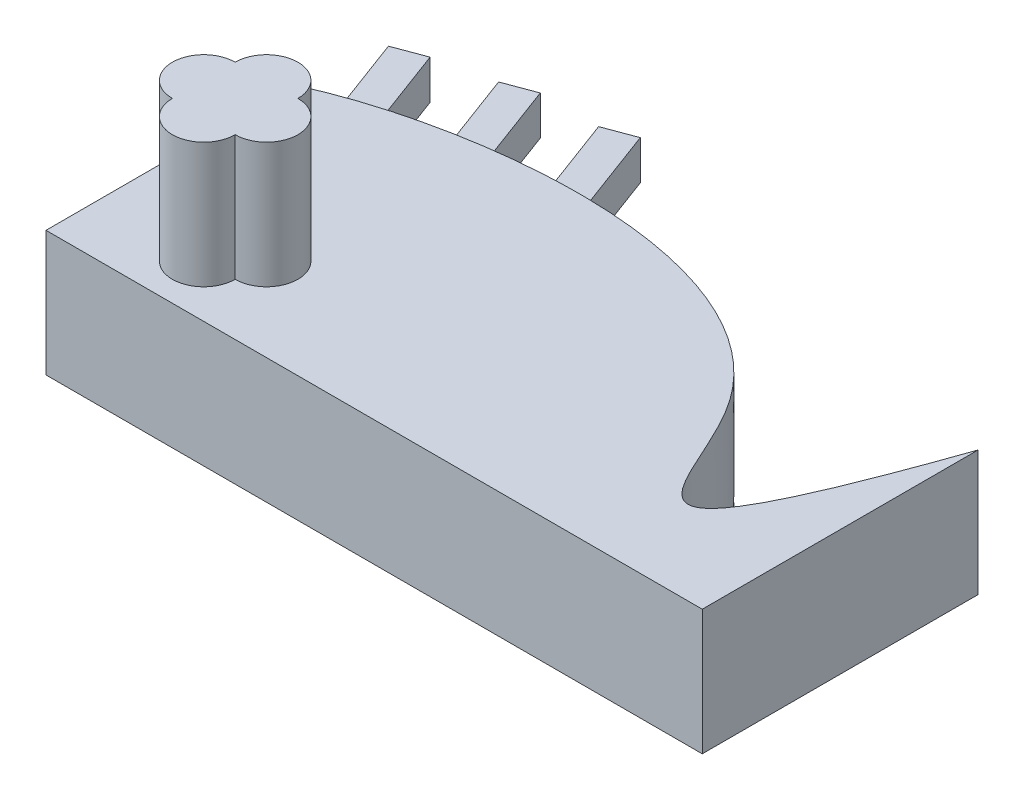
ISO-10303-21;
HEADER;
FILE_DESCRIPTION(('STEP AP214'),'2;1');
FILE_NAME('part.step','',(''),(''),'','','');
FILE_SCHEMA(('AUTOMOTIVE_DESIGN { 1 0 10303 214 1 1 1 1 }'));
ENDSEC;
DATA;
#1=APPLICATION_CONTEXT('core data for automotive mechanical design processes');
#2=APPLICATION_PROTOCOL_DEFINITION('international standard','automotive_design',2000,#1);
#3=PRODUCT_CONTEXT('',#1,'mechanical');
#4=PRODUCT('Part','Part','',(#3));
#5=PRODUCT_RELATED_PRODUCT_CATEGORY('part','',(#4));
#6=PRODUCT_DEFINITION_FORMATION('','',#4);
#7=PRODUCT_DEFINITION_CONTEXT('part definition',#1,'design');
#8=PRODUCT_DEFINITION('design','',#6,#7);
#9=PRODUCT_DEFINITION_SHAPE('','',#8);
#10=(LENGTH_UNIT() NAMED_UNIT(*) SI_UNIT(.MILLI.,.METRE.));
#11=(NAMED_UNIT(*) PLANE_ANGLE_UNIT() SI_UNIT($,.RADIAN.));
#12=(NAMED_UNIT(*) SI_UNIT($,.STERADIAN.) SOLID_ANGLE_UNIT());
#13=UNCERTAINTY_MEASURE_WITH_UNIT(LENGTH_MEASURE(1.E-05),#10,'distance_accuracy_value','');
#14=(GEOMETRIC_REPRESENTATION_CONTEXT(3) GLOBAL_UNCERTAINTY_ASSIGNED_CONTEXT((#13)) GLOBAL_UNIT_ASSIGNED_CONTEXT((#10,
#11,#12)) REPRESENTATION_CONTEXT('',''));
#15=CARTESIAN_POINT('',(0.,0.,0.));
#16=DIRECTION('',(0.,0.,1.));
#17=DIRECTION('',(1.,0.,0.));
#18=AXIS2_PLACEMENT_3D('',#15,#16,#17);
#19=CARTESIAN_POINT('',(-110.330728347982,14.4418262837156,-79.0933082133298));
#20=DIRECTION('',(-0.937117873035281,0.,0.349013025599091));
#21=DIRECTION('',(0.349013025599091,0.,0.937117873035281));
#22=AXIS2_PLACEMENT_3D('',#19,#20,#21);
#23=PLANE('',#22);
#24=DIRECTION('',(0.,-1.,0.));
#25=VECTOR('',#24,1.);
#26=CARTESIAN_POINT('',(-95.6721812728201,14.4418262837156,-39.734357545848));
#27=LINE('',#26,#25);
#28=CARTESIAN_POINT('',(-95.6721812728201,27.5581737162844,-39.734357545848));
#29=VERTEX_POINT('',#28);
#30=CARTESIAN_POINT('',(-95.6721812728201,14.4418262837156,-39.734357545848));
#31=VERTEX_POINT('',#30);
#32=EDGE_CURVE('E147',#29,#31,#27,.T.);
#33=ORIENTED_EDGE('',*,*,#32,.T.);
#34=DIRECTION('',(0.349013025599091,0.,0.937117873035281));
#35=VECTOR('',#34,1.);
#36=CARTESIAN_POINT('',(-110.330728347982,14.4418262837156,-79.0933082133298));
#37=LINE('',#36,#35);
#38=CARTESIAN_POINT('',(-110.330728347982,14.4418262837156,-79.0933082133298));
#39=VERTEX_POINT('',#38);
#40=EDGE_CURVE('E14',#39,#31,#37,.T.);
#41=ORIENTED_EDGE('',*,*,#40,.F.);
#42=DIRECTION('',(0.,-1.,0.));
#43=VECTOR('',#42,1.);
#44=CARTESIAN_POINT('',(-110.330728347982,14.4418262837156,-79.0933082133298));
#45=LINE('',#44,#43);
#46=CARTESIAN_POINT('',(-110.330728347982,27.5581737162844,-79.0933082133298));
#47=VERTEX_POINT('',#46);
#48=EDGE_CURVE('E135',#47,#39,#45,.T.);
#49=ORIENTED_EDGE('',*,*,#48,.F.);
#50=DIRECTION('',(0.349013025599091,0.,0.937117873035281));
#51=VECTOR('',#50,1.);
#52=CARTESIAN_POINT('',(-110.330728347982,27.5581737162844,-79.0933082133298));
#53=LINE('',#52,#51);
#54=EDGE_CURVE('E143',#47,#29,#53,.T.);
#55=ORIENTED_EDGE('',*,*,#54,.T.);
#56=EDGE_LOOP('',(#33,#41,#49,#55));
#57=FACE_BOUND('',#56,.T.);
#58=ADVANCED_FACE('F84',(#57),#23,.F.);
#59=CARTESIAN_POINT('',(-120.510683550477,14.4418262837156,-75.3019634231828));
#60=DIRECTION('',(0.,1.,0.));
#61=DIRECTION('',(0.,0.,1.));
#62=AXIS2_PLACEMENT_3D('',#59,#60,#61);
#63=PLANE('',#62);
#64=DIRECTION('',(-0.937117873035281,0.,0.349013025599091));
#65=VECTOR('',#64,1.);
#66=CARTESIAN_POINT('',(-105.852136475315,14.4418262837156,-35.943012755701));
#67=LINE('',#66,#65);
#68=CARTESIAN_POINT('',(-105.852136475315,14.4418262837156,-35.943012755701));
#69=VERTEX_POINT('',#68);
#70=EDGE_CURVE('E139',#31,#69,#67,.T.);
#71=ORIENTED_EDGE('',*,*,#70,.T.);
#72=DIRECTION('',(0.349013025599091,0.,0.937117873035281));
#73=VECTOR('',#72,1.);
#74=CARTESIAN_POINT('',(-120.510683550477,14.4418262837156,-75.3019634231828));
#75=LINE('',#74,#73);
#76=CARTESIAN_POINT('',(-120.510683550477,14.4418262837156,-75.3019634231828));
#77=VERTEX_POINT('',#76);
#78=EDGE_CURVE('E92',#77,#69,#75,.T.);
#79=ORIENTED_EDGE('',*,*,#78,.F.);
#80=DIRECTION('',(-0.937117873035281,0.,0.349013025599091));
#81=VECTOR('',#80,1.);
#82=CARTESIAN_POINT('',(-120.510683550477,14.4418262837156,-75.3019634231828));
#83=LINE('',#82,#81);
#84=EDGE_CURVE('E130',#39,#77,#83,.T.);
#85=ORIENTED_EDGE('',*,*,#84,.F.);
#86=ORIENTED_EDGE('',*,*,#40,.T.);
#87=EDGE_LOOP('',(#71,#79,#85,#86));
#88=FACE_BOUND('',#87,.T.);
#89=ADVANCED_FACE('F138',(#88),#63,.F.);
#90=CARTESIAN_POINT('',(-120.510683550477,14.4418262837156,-75.3019634231828));
#91=DIRECTION('',(0.937117873035281,0.,-0.349013025599091));
#92=DIRECTION('',(-0.349013025599091,0.,-0.937117873035281));
#93=AXIS2_PLACEMENT_3D('',#90,#91,#92);
#94=PLANE('',#93);
#95=DIRECTION('',(0.,1.,0.));
#96=VECTOR('',#95,1.);
#97=CARTESIAN_POINT('',(-105.852136475315,14.4418262837156,-35.943012755701));
#98=LINE('',#97,#96);
#99=CARTESIAN_POINT('',(-105.852136475315,27.5581737162844,-35.943012755701));
#100=VERTEX_POINT('',#99);
#101=EDGE_CURVE('E117',#69,#100,#98,.T.);
#102=ORIENTED_EDGE('',*,*,#101,.T.);
#103=DIRECTION('',(0.349013025599091,0.,0.937117873035281));
#104=VECTOR('',#103,1.);
#105=CARTESIAN_POINT('',(-120.510683550477,27.5581737162844,-75.3019634231828));
#106=LINE('',#105,#104);
#107=CARTESIAN_POINT('',(-120.510683550477,27.5581737162844,-75.3019634231828));
#108=VERTEX_POINT('',#107);
#109=EDGE_CURVE('E140',#108,#100,#106,.T.);
#110=ORIENTED_EDGE('',*,*,#109,.F.);
#111=DIRECTION('',(0.,1.,0.));
#112=VECTOR('',#111,1.);
#113=CARTESIAN_POINT('',(-120.510683550477,14.4418262837156,-75.3019634231828));
#114=LINE('',#113,#112);
#115=EDGE_CURVE('E133',#77,#108,#114,.T.);
#116=ORIENTED_EDGE('',*,*,#115,.F.);
#117=ORIENTED_EDGE('',*,*,#78,.T.);
#118=EDGE_LOOP('',(#102,#110,#116,#117));
#119=FACE_BOUND('',#118,.T.);
#120=ADVANCED_FACE('F141',(#119),#94,.F.);
#121=CARTESIAN_POINT('',(-120.510683550477,27.5581737162844,-75.3019634231828));
#122=DIRECTION('',(0.,-1.,0.));
#123=DIRECTION('',(0.,0.,-1.));
#124=AXIS2_PLACEMENT_3D('',#121,#122,#123);
#125=PLANE('',#124);
#126=DIRECTION('',(0.937117873035281,0.,-0.349013025599091));
#127=VECTOR('',#126,1.);
#128=CARTESIAN_POINT('',(-105.852136475315,27.5581737162844,-35.943012755701));
#129=LINE('',#128,#127);
#130=EDGE_CURVE('E123',#100,#29,#129,.T.);
#131=ORIENTED_EDGE('',*,*,#130,.T.);
#132=ORIENTED_EDGE('',*,*,#54,.F.);
#133=DIRECTION('',(0.937117873035281,0.,-0.349013025599091));
#134=VECTOR('',#133,1.);
#135=CARTESIAN_POINT('',(-120.510683550477,27.5581737162844,-75.3019634231828));
#136=LINE('',#135,#134);
#137=EDGE_CURVE('E100',#108,#47,#136,.T.);
#138=ORIENTED_EDGE('',*,*,#137,.F.);
#139=ORIENTED_EDGE('',*,*,#109,.T.);
#140=EDGE_LOOP('',(#131,#132,#138,#139));
#141=FACE_BOUND('',#140,.T.);
#142=ADVANCED_FACE('F154',(#141),#125,.F.);
#143=CARTESIAN_POINT('',(-39.3081553435585,0.,-105.544413035202));
#144=DIRECTION('',(-0.349013025599091,0.,-0.937117873035281));
#145=DIRECTION('',(-0.937117873035281,0.,0.349013025599091));
#146=AXIS2_PLACEMENT_3D('',#143,#144,#145);
#147=PLANE('',#146);
#148=ORIENTED_EDGE('',*,*,#48,.T.);
#149=ORIENTED_EDGE('',*,*,#84,.T.);
#150=ORIENTED_EDGE('',*,*,#115,.T.);
#151=ORIENTED_EDGE('',*,*,#137,.T.);
#152=EDGE_LOOP('',(#148,#149,#150,#151));
#153=FACE_BOUND('',#152,.T.);
#154=ADVANCED_FACE('F131',(#153),#147,.T.);
#155=CARTESIAN_POINT('',(-24.6496082683967,0.,-66.1854623677202));
#156=DIRECTION('',(-0.349013025599091,0.,-0.937117873035281));
#157=DIRECTION('',(-0.937117873035281,0.,0.349013025599091));
#158=AXIS2_PLACEMENT_3D('',#155,#156,#157);
#159=PLANE('',#158);
#160=ORIENTED_EDGE('',*,*,#32,.F.);
#161=ORIENTED_EDGE('',*,*,#130,.F.);
#162=ORIENTED_EDGE('',*,*,#101,.F.);
#163=ORIENTED_EDGE('',*,*,#70,.F.);
#164=EDGE_LOOP('',(#160,#161,#162,#163));
#165=FACE_BOUND('',#164,.T.);
#166=ADVANCED_FACE('F157',(#165),#159,.F.);
#167=CLOSED_SHELL('',(#58,#89,#120,#142,#154,#166));
#168=MANIFOLD_SOLID_BREP('B2',#167);
#169=CARTESIAN_POINT('',(-74.5826484380044,84.,11.4882685040511));
#170=DIRECTION('',(0.,-1.,0.));
#171=DIRECTION('',(0.,0.,-1.));
#172=AXIS2_PLACEMENT_3D('',#169,#170,#171);
#173=CYLINDRICAL_SURFACE('',#172,10.5224386168195);
#174=DIRECTION('',(0.,-1.,0.));
#175=VECTOR('',#174,1.);
#176=CARTESIAN_POINT('',(-85.1050870548239,63.0000000000001,11.4882685040512));
#177=LINE('',#176,#175);
#178=CARTESIAN_POINT('',(-85.1050870548239,84.,11.4882685040514));
#179=VERTEX_POINT('',#178);
#180=CARTESIAN_POINT('',(-85.1050870548239,42.,11.4882685040511));
#181=VERTEX_POINT('',#180);
#182=EDGE_CURVE('E383',#179,#181,#177,.T.);
#183=ORIENTED_EDGE('',*,*,#182,.F.);
#184=CARTESIAN_POINT('',(-74.5826484380044,84.,11.4882685040511));
#185=DIRECTION('',(0.,1.,0.));
#186=DIRECTION('',(0.,0.,1.));
#187=AXIS2_PLACEMENT_3D('',#184,#185,#186);
#188=CIRCLE('',#187,10.5224386168195);
#189=CARTESIAN_POINT('',(-64.0602098211848,84.0000000000001,11.4882685040514));
#190=VERTEX_POINT('',#189);
#191=EDGE_CURVE('E387',#190,#179,#188,.T.);
#192=ORIENTED_EDGE('',*,*,#191,.F.);
#193=DIRECTION('',(0.,-1.,0.));
#194=VECTOR('',#193,1.);
#195=CARTESIAN_POINT('',(-64.0602098211848,63.0000000000001,11.4882685040512));
#196=LINE('',#195,#194);
#197=CARTESIAN_POINT('',(-64.0602098211848,42.,11.4882685040512));
#198=VERTEX_POINT('',#197);
#199=EDGE_CURVE('E364',#198,#190,#196,.F.);
#200=ORIENTED_EDGE('',*,*,#199,.F.);
#201=CARTESIAN_POINT('',(-74.5826484380044,42.,11.4882685040511));
#202=DIRECTION('',(0.,-1.,0.));
#203=DIRECTION('',(0.,0.,-1.));
#204=AXIS2_PLACEMENT_3D('',#201,#202,#203);
#205=CIRCLE('',#204,10.5224386168195);
#206=EDGE_CURVE('E82',#198,#181,#205,.F.);
#207=ORIENTED_EDGE('',*,*,#206,.T.);
#208=EDGE_LOOP('',(#183,#192,#200,#207));
#209=FACE_BOUND('',#208,.T.);
#210=ADVANCED_FACE('F208',(#209),#173,.T.);
#211=CARTESIAN_POINT('',(-110.,401.10438679184,-34.018302372733));
#212=CARTESIAN_POINT('',(-67.2471150708879,401.10438679184,-53.6902094858161));
#213=CARTESIAN_POINT('',(72.7205199180523,401.10438679184,-69.0777009280798));
#214=CARTESIAN_POINT('',(73.8098024767226,401.10438679184,61.2581735272852));
#215=CARTESIAN_POINT('',(110.,401.10438679184,-42.435201928873));
#216=B_SPLINE_CURVE_WITH_KNOTS('',3,(#211,#212,#213,#214,#215),.UNSPECIFIED.,.F.,.F.,(4,1,4),
(0.,0.646100978433412,1.),.UNSPECIFIED.);
#217=DIRECTION('',(0.,-1.,0.));
#218=VECTOR('',#217,1.);
#219=SURFACE_OF_LINEAR_EXTRUSION('',#216,#218);
#220=CARTESIAN_POINT('',(-110.,42.,-34.018302372733));
#221=CARTESIAN_POINT('',(-67.2471150708879,42.,-53.6902094858161));
#222=CARTESIAN_POINT('',(72.7205199180523,42.,-69.0777009280798));
#223=CARTESIAN_POINT('',(73.8098024767226,42.,61.2581735272852));
#224=CARTESIAN_POINT('',(110.,42.,-42.435201928873));
#225=B_SPLINE_CURVE_WITH_KNOTS('',3,(#220,#221,#222,#223,#224),.UNSPECIFIED.,.F.,.F.,(4,1,4),
(0.,0.646100978433412,1.),.UNSPECIFIED.);
#226=CARTESIAN_POINT('',(-33.6675982245598,42.,-50.));
#227=VERTEX_POINT('',#226);
#228=CARTESIAN_POINT('',(-110.,42.,-34.0183023727329));
#229=VERTEX_POINT('',#228);
#230=EDGE_CURVE('E474',#227,#229,#225,.F.);
#231=ORIENTED_EDGE('',*,*,#230,.F.);
#232=DIRECTION('',(0.,-1.,0.));
#233=VECTOR('',#232,1.);
#234=CARTESIAN_POINT('',(-33.667598224559,21.,-50.));
#235=LINE('',#234,#233);
#236=CARTESIAN_POINT('',(-33.6675982245598,0.,-50.));
#237=VERTEX_POINT('',#236);
#238=EDGE_CURVE('E508',#227,#237,#235,.T.);
#239=ORIENTED_EDGE('',*,*,#238,.T.);
#240=CARTESIAN_POINT('',(-110.,0.,-34.018302372733));
#241=CARTESIAN_POINT('',(-67.2471150708879,0.,-53.6902094858161));
#242=CARTESIAN_POINT('',(72.7205199180523,0.,-69.0777009280798));
#243=CARTESIAN_POINT('',(73.8098024767226,0.,61.2581735272852));
#244=CARTESIAN_POINT('',(110.,0.,-42.435201928873));
#245=B_SPLINE_CURVE_WITH_KNOTS('',3,(#240,#241,#242,#243,#244),.UNSPECIFIED.,.F.,.F.,(4,1,4),
(0.,0.646100978433412,1.),.UNSPECIFIED.);
#246=CARTESIAN_POINT('',(-110.,0.,-34.018302372733));
#247=VERTEX_POINT('',#246);
#248=EDGE_CURVE('E491',#237,#247,#245,.F.);
#249=ORIENTED_EDGE('',*,*,#248,.T.);
#250=DIRECTION('',(0.,-1.,0.));
#251=VECTOR('',#250,1.);
#252=CARTESIAN_POINT('',(-110.,401.10438679184,-34.018302372733));
#253=LINE('',#252,#251);
#254=EDGE_CURVE('E498',#229,#247,#253,.T.);
#255=ORIENTED_EDGE('',*,*,#254,.F.);
#256=EDGE_LOOP('',(#231,#239,#249,#255));
#257=FACE_BOUND('',#256,.T.);
#258=DIRECTION('',(0.,-1.,0.));
#259=VECTOR('',#258,1.);
#260=CARTESIAN_POINT('',(-77.2681220435755,21.,-44.7578339003173));
#261=LINE('',#260,#259);
#262=CARTESIAN_POINT('',(-77.2681220435756,27.5581737162844,-44.7578339003176));
#263=VERTEX_POINT('',#262);
#264=CARTESIAN_POINT('',(-77.2681220435755,14.4418262837156,-44.7578339003173));
#265=VERTEX_POINT('',#264);
#266=EDGE_CURVE('E572',#263,#265,#261,.T.);
#267=ORIENTED_EDGE('',*,*,#266,.T.);
#268=CARTESIAN_POINT('',(-110.,14.4418262837156,-34.018302372733));
#269=CARTESIAN_POINT('',(-67.2471150708879,14.4418262837156,-53.6902094858161));
#270=CARTESIAN_POINT('',(72.7205199180523,14.4418262837156,-69.0777009280798));
#271=CARTESIAN_POINT('',(73.8098024767226,14.4418262837156,61.2581735272852));
#272=CARTESIAN_POINT('',(110.,14.4418262837156,-42.435201928873));
#273=B_SPLINE_CURVE_WITH_KNOTS('',3,(#268,#269,#270,#271,#272),.UNSPECIFIED.,.F.,.F.,(4,1,4),
(0.,0.646100978433412,1.),.UNSPECIFIED.);
#274=CARTESIAN_POINT('',(-71.8986472816458,14.4418262837156,-45.9030420848122));
#275=VERTEX_POINT('',#274);
#276=EDGE_CURVE('E583',#265,#275,#273,.T.);
#277=ORIENTED_EDGE('',*,*,#276,.T.);
#278=DIRECTION('',(0.,-1.,0.));
#279=VECTOR('',#278,1.);
#280=CARTESIAN_POINT('',(-71.8986472816458,21.,-45.9030420848122));
#281=LINE('',#280,#279);
#282=CARTESIAN_POINT('',(-71.8986472816458,27.5581737162844,-45.9030420848122));
#283=VERTEX_POINT('',#282);
#284=EDGE_CURVE('E560',#275,#283,#281,.F.);
#285=ORIENTED_EDGE('',*,*,#284,.T.);
#286=CARTESIAN_POINT('',(-110.,27.5581737162844,-34.018302372733));
#287=CARTESIAN_POINT('',(-67.2471150708879,27.5581737162844,-53.6902094858161));
#288=CARTESIAN_POINT('',(72.7205199180523,27.5581737162844,-69.0777009280798));
#289=CARTESIAN_POINT('',(73.8098024767226,27.5581737162844,61.2581735272852));
#290=CARTESIAN_POINT('',(110.,27.5581737162844,-42.435201928873));
#291=B_SPLINE_CURVE_WITH_KNOTS('',3,(#286,#287,#288,#289,#290),.UNSPECIFIED.,.F.,.F.,(4,1,4),
(0.,0.646100978433412,1.),.UNSPECIFIED.);
#292=EDGE_CURVE('E567',#283,#263,#291,.F.);
#293=ORIENTED_EDGE('',*,*,#292,.T.);
#294=EDGE_LOOP('',(#267,#277,#285,#293));
#295=FACE_BOUND('',#294,.T.);
#296=DIRECTION('',(0.,-1.,0.));
#297=VECTOR('',#296,1.);
#298=CARTESIAN_POINT('',(-47.8146007751934,21.,-49.3119283923371));
#299=LINE('',#298,#297);
#300=CARTESIAN_POINT('',(-47.8146007751934,27.5581737162844,-49.3119283923371));
#301=VERTEX_POINT('',#300);
#302=CARTESIAN_POINT('',(-47.8146007751934,14.4418262837156,-49.3119283923371));
#303=VERTEX_POINT('',#302);
#304=EDGE_CURVE('E601',#301,#303,#299,.T.);
#305=ORIENTED_EDGE('',*,*,#304,.T.);
#306=CARTESIAN_POINT('',(-110.,14.4418262837156,-34.018302372733));
#307=CARTESIAN_POINT('',(-67.2471150708879,14.4418262837156,-53.6902094858161));
#308=CARTESIAN_POINT('',(72.7205199180523,14.4418262837156,-69.0777009280798));
#309=CARTESIAN_POINT('',(73.8098024767226,14.4418262837156,61.2581735272852));
#310=CARTESIAN_POINT('',(110.,14.4418262837156,-42.435201928873));
#311=B_SPLINE_CURVE_WITH_KNOTS('',3,(#306,#307,#308,#309,#310),.UNSPECIFIED.,.F.,.F.,(4,1,4),
(0.,0.646100978433412,1.),.UNSPECIFIED.);
#312=CARTESIAN_POINT('',(-42.1656827907477,14.4418262837156,-49.7068171929958));
#313=VERTEX_POINT('',#312);
#314=EDGE_CURVE('E217',#303,#313,#311,.T.);
#315=ORIENTED_EDGE('',*,*,#314,.T.);
#316=DIRECTION('',(0.,-1.,0.));
#317=VECTOR('',#316,1.);
#318=CARTESIAN_POINT('',(-42.1656827907477,21.,-49.7068171929958));
#319=LINE('',#318,#317);
#320=CARTESIAN_POINT('',(-42.1656827907477,27.5581737162844,-49.7068171929958));
#321=VERTEX_POINT('',#320);
#322=EDGE_CURVE('E588',#313,#321,#319,.F.);
#323=ORIENTED_EDGE('',*,*,#322,.T.);
#324=CARTESIAN_POINT('',(-110.,27.5581737162844,-34.018302372733));
#325=CARTESIAN_POINT('',(-67.2471150708879,27.5581737162844,-53.6902094858161));
#326=CARTESIAN_POINT('',(72.7205199180523,27.5581737162844,-69.0777009280798));
#327=CARTESIAN_POINT('',(73.8098024767226,27.5581737162844,61.2581735272852));
#328=CARTESIAN_POINT('',(110.,27.5581737162844,-42.435201928873));
#329=B_SPLINE_CURVE_WITH_KNOTS('',3,(#324,#325,#326,#327,#328),.UNSPECIFIED.,.F.,.F.,(4,1,4),
(0.,0.646100978433412,1.),.UNSPECIFIED.);
#330=EDGE_CURVE('E595',#321,#301,#329,.F.);
#331=ORIENTED_EDGE('',*,*,#330,.T.);
#332=EDGE_LOOP('',(#305,#315,#323,#331));
#333=FACE_BOUND('',#332,.T.);
#334=ADVANCED_FACE('F615',(#257,#295,#333),#219,.T.);
#335=CARTESIAN_POINT('',(110.,42.,50.));
#336=DIRECTION('',(-1.,0.,0.));
#337=DIRECTION('',(0.,0.,1.));
#338=AXIS2_PLACEMENT_3D('',#335,#336,#337);
#339=PLANE('',#338);
#340=DIRECTION('',(0.,-1.,0.));
#341=VECTOR('',#340,1.);
#342=CARTESIAN_POINT('',(110.,401.10438679184,-42.435201928873));
#343=LINE('',#342,#341);
#344=CARTESIAN_POINT('',(110.,42.,-42.4352019288729));
#345=VERTEX_POINT('',#344);
#346=CARTESIAN_POINT('',(110.,0.,-42.4352019288729));
#347=VERTEX_POINT('',#346);
#348=EDGE_CURVE('E496',#345,#347,#343,.T.);
#349=ORIENTED_EDGE('',*,*,#348,.F.);
#350=DIRECTION('',(0.,0.,-1.));
#351=VECTOR('',#350,1.);
#352=CARTESIAN_POINT('',(110.,42.,50.));
#353=LINE('',#352,#351);
#354=CARTESIAN_POINT('',(110.,42.,50.));
#355=VERTEX_POINT('',#354);
#356=EDGE_CURVE('E517',#355,#345,#353,.T.);
#357=ORIENTED_EDGE('',*,*,#356,.F.);
#358=DIRECTION('',(0.,-1.,0.));
#359=VECTOR('',#358,1.);
#360=CARTESIAN_POINT('',(110.,42.,50.));
#361=LINE('',#360,#359);
#362=CARTESIAN_POINT('',(110.,0.,50.));
#363=VERTEX_POINT('',#362);
#364=EDGE_CURVE('E532',#355,#363,#361,.T.);
#365=ORIENTED_EDGE('',*,*,#364,.T.);
#366=DIRECTION('',(0.,0.,-1.));
#367=VECTOR('',#366,1.);
#368=CARTESIAN_POINT('',(110.,0.,50.));
#369=LINE('',#368,#367);
#370=EDGE_CURVE('E514',#363,#347,#369,.T.);
#371=ORIENTED_EDGE('',*,*,#370,.T.);
#372=EDGE_LOOP('',(#349,#357,#365,#371));
#373=FACE_BOUND('',#372,.T.);
#374=ADVANCED_FACE('F210',(#373),#339,.F.);
#375=CARTESIAN_POINT('',(-110.,42.,-50.));
#376=DIRECTION('',(0.,0.,1.));
#377=DIRECTION('',(1.,0.,0.));
#378=AXIS2_PLACEMENT_3D('',#375,#376,#377);
#379=PLANE('',#378);
#380=ORIENTED_EDGE('',*,*,#238,.F.);
#381=DIRECTION('',(-1.,0.,0.));
#382=VECTOR('',#381,1.);
#383=CARTESIAN_POINT('',(-110.,42.,-50.));
#384=LINE('',#383,#382);
#385=CARTESIAN_POINT('',(-28.9222592647334,42.,-50.));
#386=VERTEX_POINT('',#385);
#387=EDGE_CURVE('E521',#386,#227,#384,.T.);
#388=ORIENTED_EDGE('',*,*,#387,.F.);
#389=DIRECTION('',(0.,-1.,0.));
#390=VECTOR('',#389,1.);
#391=CARTESIAN_POINT('',(-28.9222592647334,21.,-50.));
#392=LINE('',#391,#390);
#393=CARTESIAN_POINT('',(-28.9222592647334,0.,-50.));
#394=VERTEX_POINT('',#393);
#395=EDGE_CURVE('E502',#394,#386,#392,.F.);
#396=ORIENTED_EDGE('',*,*,#395,.F.);
#397=DIRECTION('',(-1.,0.,0.));
#398=VECTOR('',#397,1.);
#399=CARTESIAN_POINT('',(-110.,0.,-50.));
#400=LINE('',#399,#398);
#401=EDGE_CURVE('E542',#394,#237,#400,.T.);
#402=ORIENTED_EDGE('',*,*,#401,.T.);
#403=EDGE_LOOP('',(#380,#388,#396,#402));
#404=FACE_BOUND('',#403,.T.);
#405=ADVANCED_FACE('F746',(#404),#379,.F.);
#406=CARTESIAN_POINT('',(-110.,42.,50.));
#407=DIRECTION('',(1.,0.,0.));
#408=DIRECTION('',(0.,0.,-1.));
#409=AXIS2_PLACEMENT_3D('',#406,#407,#408);
#410=PLANE('',#409);
#411=ORIENTED_EDGE('',*,*,#254,.T.);
#412=DIRECTION('',(0.,0.,1.));
#413=VECTOR('',#412,1.);
#414=CARTESIAN_POINT('',(-110.,0.,50.));
#415=LINE('',#414,#413);
#416=CARTESIAN_POINT('',(-110.,0.,50.));
#417=VERTEX_POINT('',#416);
#418=EDGE_CURVE('E545',#247,#417,#415,.T.);
#419=ORIENTED_EDGE('',*,*,#418,.T.);
#420=DIRECTION('',(0.,-1.,0.));
#421=VECTOR('',#420,1.);
#422=CARTESIAN_POINT('',(-110.,42.,50.));
#423=LINE('',#422,#421);
#424=CARTESIAN_POINT('',(-110.,42.,50.));
#425=VERTEX_POINT('',#424);
#426=EDGE_CURVE('E543',#425,#417,#423,.T.);
#427=ORIENTED_EDGE('',*,*,#426,.F.);
#428=DIRECTION('',(0.,0.,1.));
#429=VECTOR('',#428,1.);
#430=CARTESIAN_POINT('',(-110.,42.,50.));
#431=LINE('',#430,#429);
#432=EDGE_CURVE('E526',#229,#425,#431,.T.);
#433=ORIENTED_EDGE('',*,*,#432,.F.);
#434=EDGE_LOOP('',(#411,#419,#427,#433));
#435=FACE_BOUND('',#434,.T.);
#436=ADVANCED_FACE('F697',(#435),#410,.F.);
#437=CARTESIAN_POINT('',(0.,42.,0.));
#438=DIRECTION('',(0.,-1.,0.));
#439=DIRECTION('',(0.,0.,-1.));
#440=AXIS2_PLACEMENT_3D('',#437,#438,#439);
#441=PLANE('',#440);
#442=CARTESIAN_POINT('',(-85.1050870548239,42.,22.0107071208706));
#443=DIRECTION('',(0.,-1.,0.));
#444=DIRECTION('',(-1.,0.,0.));
#445=AXIS2_PLACEMENT_3D('',#442,#443,#444);
#446=CIRCLE('',#445,10.5224386168195);
#447=CARTESIAN_POINT('',(-85.1050870548239,42.,32.5331457376903));
#448=VERTEX_POINT('',#447);
#449=EDGE_CURVE('E376',#181,#448,#446,.F.);
#450=ORIENTED_EDGE('',*,*,#449,.F.);
#451=ORIENTED_EDGE('',*,*,#206,.F.);
#452=CARTESIAN_POINT('',(-64.0602098211848,42.,22.0107071208706));
#453=DIRECTION('',(0.,-1.,0.));
#454=DIRECTION('',(1.,0.,0.));
#455=AXIS2_PLACEMENT_3D('',#452,#453,#454);
#456=CIRCLE('',#455,10.5224386168195);
#457=CARTESIAN_POINT('',(-64.0602098211848,42.,32.5331457376901));
#458=VERTEX_POINT('',#457);
#459=EDGE_CURVE('E229',#458,#198,#456,.F.);
#460=ORIENTED_EDGE('',*,*,#459,.F.);
#461=CARTESIAN_POINT('',(-74.5826484380044,42.,32.5331457376901));
#462=DIRECTION('',(0.,-1.,0.));
#463=DIRECTION('',(0.,0.,1.));
#464=AXIS2_PLACEMENT_3D('',#461,#462,#463);
#465=CIRCLE('',#464,10.5224386168195);
#466=EDGE_CURVE('E224',#448,#458,#465,.F.);
#467=ORIENTED_EDGE('',*,*,#466,.F.);
#468=EDGE_LOOP('',(#450,#451,#460,#467));
#469=FACE_BOUND('',#468,.T.);
#470=ORIENTED_EDGE('',*,*,#230,.T.);
#471=ORIENTED_EDGE('',*,*,#432,.T.);
#472=DIRECTION('',(1.,0.,0.));
#473=VECTOR('',#472,1.);
#474=CARTESIAN_POINT('',(-110.,42.,50.));
#475=LINE('',#474,#473);
#476=EDGE_CURVE('E529',#425,#355,#475,.T.);
#477=ORIENTED_EDGE('',*,*,#476,.T.);
#478=ORIENTED_EDGE('',*,*,#356,.T.);
#479=EDGE_CURVE('E479',#345,#386,#225,.F.);
#480=ORIENTED_EDGE('',*,*,#479,.T.);
#481=ORIENTED_EDGE('',*,*,#387,.T.);
#482=EDGE_LOOP('',(#470,#471,#477,#478,#480,#481));
#483=FACE_BOUND('',#482,.T.);
#484=ADVANCED_FACE('F691',(#469,#483),#441,.F.);
#485=CARTESIAN_POINT('',(-110.,42.,50.));
#486=DIRECTION('',(0.,0.,-1.));
#487=DIRECTION('',(-1.,0.,0.));
#488=AXIS2_PLACEMENT_3D('',#485,#486,#487);
#489=PLANE('',#488);
#490=DIRECTION('',(1.,0.,0.));
#491=VECTOR('',#490,1.);
#492=CARTESIAN_POINT('',(-110.,0.,50.));
#493=LINE('',#492,#491);
#494=EDGE_CURVE('E522',#417,#363,#493,.T.);
#495=ORIENTED_EDGE('',*,*,#494,.T.);
#496=ORIENTED_EDGE('',*,*,#364,.F.);
#497=ORIENTED_EDGE('',*,*,#476,.F.);
#498=ORIENTED_EDGE('',*,*,#426,.T.);
#499=EDGE_LOOP('',(#495,#496,#497,#498));
#500=FACE_BOUND('',#499,.T.);
#501=ADVANCED_FACE('F696',(#500),#489,.F.);
#502=CARTESIAN_POINT('',(0.,0.,0.));
#503=DIRECTION('',(0.,-1.,0.));
#504=DIRECTION('',(0.,0.,-1.));
#505=AXIS2_PLACEMENT_3D('',#502,#503,#504);
#506=PLANE('',#505);
#507=EDGE_CURVE('E488',#347,#394,#245,.F.);
#508=ORIENTED_EDGE('',*,*,#507,.F.);
#509=ORIENTED_EDGE('',*,*,#370,.F.);
#510=ORIENTED_EDGE('',*,*,#494,.F.);
#511=ORIENTED_EDGE('',*,*,#418,.F.);
#512=ORIENTED_EDGE('',*,*,#248,.F.);
#513=ORIENTED_EDGE('',*,*,#401,.F.);
#514=EDGE_LOOP('',(#508,#509,#510,#511,#512,#513));
#515=FACE_BOUND('',#514,.T.);
#516=ADVANCED_FACE('F743',(#515),#506,.T.);
#517=ORIENTED_EDGE('',*,*,#507,.T.);
#518=ORIENTED_EDGE('',*,*,#395,.T.);
#519=ORIENTED_EDGE('',*,*,#479,.F.);
#520=ORIENTED_EDGE('',*,*,#348,.T.);
#521=EDGE_LOOP('',(#517,#518,#519,#520));
#522=FACE_BOUND('',#521,.T.);
#523=ADVANCED_FACE('F648',(#522),#219,.T.);
#524=CARTESIAN_POINT('',(-81.4672167555601,14.4418262837156,-87.1576651473675));
#525=DIRECTION('',(-0.937117873035281,0.,0.349013025599091));
#526=DIRECTION('',(0.349013025599091,0.,0.937117873035281));
#527=AXIS2_PLACEMENT_3D('',#524,#525,#526);
#528=PLANE('',#527);
#529=DIRECTION('',(0.,-1.,0.));
#530=VECTOR('',#529,1.);
#531=CARTESIAN_POINT('',(-66.8086696803983,14.4418262837156,-47.7987144798857));
#532=LINE('',#531,#530);
#533=CARTESIAN_POINT('',(-66.8086696803983,27.5581737162844,-47.7987144798857));
#534=VERTEX_POINT('',#533);
#535=CARTESIAN_POINT('',(-66.8086696803983,14.4418262837156,-47.7987144798857));
#536=VERTEX_POINT('',#535);
#537=EDGE_CURVE('E432',#534,#536,#532,.T.);
#538=ORIENTED_EDGE('',*,*,#537,.T.);
#539=DIRECTION('',(0.349013025599091,0.,0.937117873035281));
#540=VECTOR('',#539,1.);
#541=CARTESIAN_POINT('',(-81.4672167555601,14.4418262837156,-87.1576651473675));
#542=LINE('',#541,#540);
#543=CARTESIAN_POINT('',(-81.4672167555601,14.4418262837156,-87.1576651473675));
#544=VERTEX_POINT('',#543);
#545=EDGE_CURVE('E435',#544,#536,#542,.T.);
#546=ORIENTED_EDGE('',*,*,#545,.F.);
#547=DIRECTION('',(0.,-1.,0.));
#548=VECTOR('',#547,1.);
#549=CARTESIAN_POINT('',(-81.4672167555601,14.4418262837156,-87.1576651473675));
#550=LINE('',#549,#548);
#551=CARTESIAN_POINT('',(-81.4672167555601,27.5581737162844,-87.1576651473675));
#552=VERTEX_POINT('',#551);
#553=EDGE_CURVE('E439',#552,#544,#550,.T.);
#554=ORIENTED_EDGE('',*,*,#553,.F.);
#555=DIRECTION('',(0.349013025599091,0.,0.937117873035281));
#556=VECTOR('',#555,1.);
#557=CARTESIAN_POINT('',(-81.4672167555601,27.5581737162844,-87.1576651473675));
#558=LINE('',#557,#556);
#559=EDGE_CURVE('E443',#552,#534,#558,.T.);
#560=ORIENTED_EDGE('',*,*,#559,.T.);
#561=EDGE_LOOP('',(#538,#546,#554,#560));
#562=FACE_BOUND('',#561,.T.);
#563=ADVANCED_FACE('F637',(#562),#528,.F.);
#564=CARTESIAN_POINT('',(-91.6471719580551,14.4418262837156,-83.3663203572205));
#565=DIRECTION('',(0.,1.,0.));
#566=DIRECTION('',(0.,0.,1.));
#567=AXIS2_PLACEMENT_3D('',#564,#565,#566);
#568=PLANE('',#567);
#569=ORIENTED_EDGE('',*,*,#276,.F.);
#570=DIRECTION('',(0.349013025599091,0.,0.937117873035281));
#571=VECTOR('',#570,1.);
#572=CARTESIAN_POINT('',(-91.6471719580551,14.4418262837156,-83.3663203572205));
#573=LINE('',#572,#571);
#574=CARTESIAN_POINT('',(-91.6471719580551,14.4418262837156,-83.3663203572205));
#575=VERTEX_POINT('',#574);
#576=EDGE_CURVE('E451',#575,#265,#573,.T.);
#577=ORIENTED_EDGE('',*,*,#576,.F.);
#578=DIRECTION('',(-0.937117873035281,0.,0.349013025599091));
#579=VECTOR('',#578,1.);
#580=CARTESIAN_POINT('',(-91.6471719580551,14.4418262837156,-83.3663203572205));
#581=LINE('',#580,#579);
#582=EDGE_CURVE('E455',#544,#575,#581,.T.);
#583=ORIENTED_EDGE('',*,*,#582,.F.);
#584=ORIENTED_EDGE('',*,*,#545,.T.);
#585=DIRECTION('',(-0.937117873035281,0.,0.349013025599091));
#586=VECTOR('',#585,1.);
#587=CARTESIAN_POINT('',(-76.9886248828933,14.4418262837156,-44.0073696897387));
#588=LINE('',#587,#586);
#589=EDGE_CURVE('E447',#536,#275,#588,.T.);
#590=ORIENTED_EDGE('',*,*,#589,.T.);
#591=EDGE_LOOP('',(#569,#577,#583,#584,#590));
#592=FACE_BOUND('',#591,.T.);
#593=ADVANCED_FACE('F647',(#592),#568,.F.);
#594=CARTESIAN_POINT('',(-91.6471719580551,14.4418262837156,-83.3663203572205));
#595=DIRECTION('',(0.937117873035281,0.,-0.349013025599091));
#596=DIRECTION('',(-0.349013025599091,0.,-0.937117873035281));
#597=AXIS2_PLACEMENT_3D('',#594,#595,#596);
#598=PLANE('',#597);
#599=ORIENTED_EDGE('',*,*,#266,.F.);
#600=DIRECTION('',(0.349013025599091,0.,0.937117873035281));
#601=VECTOR('',#600,1.);
#602=CARTESIAN_POINT('',(-91.6471719580551,27.5581737162844,-83.3663203572205));
#603=LINE('',#602,#601);
#604=CARTESIAN_POINT('',(-91.6471719580551,27.5581737162844,-83.3663203572205));
#605=VERTEX_POINT('',#604);
#606=EDGE_CURVE('E459',#605,#263,#603,.T.);
#607=ORIENTED_EDGE('',*,*,#606,.F.);
#608=DIRECTION('',(0.,1.,0.));
#609=VECTOR('',#608,1.);
#610=CARTESIAN_POINT('',(-91.6471719580551,14.4418262837156,-83.3663203572205));
#611=LINE('',#610,#609);
#612=EDGE_CURVE('E463',#575,#605,#611,.T.);
#613=ORIENTED_EDGE('',*,*,#612,.F.);
#614=ORIENTED_EDGE('',*,*,#576,.T.);
#615=EDGE_LOOP('',(#599,#607,#613,#614));
#616=FACE_BOUND('',#615,.T.);
#617=ADVANCED_FACE('F782',(#616),#598,.F.);
#618=CARTESIAN_POINT('',(-91.6471719580551,27.5581737162844,-83.3663203572205));
#619=DIRECTION('',(0.,-1.,0.));
#620=DIRECTION('',(0.,0.,-1.));
#621=AXIS2_PLACEMENT_3D('',#618,#619,#620);
#622=PLANE('',#621);
#623=ORIENTED_EDGE('',*,*,#292,.F.);
#624=DIRECTION('',(0.937117873035281,0.,-0.349013025599091));
#625=VECTOR('',#624,1.);
#626=CARTESIAN_POINT('',(-76.9886248828933,27.5581737162844,-44.0073696897387));
#627=LINE('',#626,#625);
#628=EDGE_CURVE('E467',#283,#534,#627,.T.);
#629=ORIENTED_EDGE('',*,*,#628,.T.);
#630=ORIENTED_EDGE('',*,*,#559,.F.);
#631=DIRECTION('',(0.937117873035281,0.,-0.349013025599091));
#632=VECTOR('',#631,1.);
#633=CARTESIAN_POINT('',(-91.6471719580551,27.5581737162844,-83.3663203572205));
#634=LINE('',#633,#632);
#635=EDGE_CURVE('E470',#605,#552,#634,.T.);
#636=ORIENTED_EDGE('',*,*,#635,.F.);
#637=ORIENTED_EDGE('',*,*,#606,.T.);
#638=EDGE_LOOP('',(#623,#629,#630,#636,#637));
#639=FACE_BOUND('',#638,.T.);
#640=ADVANCED_FACE('F778',(#639),#622,.F.);
#641=CARTESIAN_POINT('',(-10.4446437511368,0.,-113.60876996924));
#642=DIRECTION('',(-0.349013025599091,0.,-0.937117873035281));
#643=DIRECTION('',(-0.937117873035281,0.,0.349013025599091));
#644=AXIS2_PLACEMENT_3D('',#641,#642,#643);
#645=PLANE('',#644);
#646=ORIENTED_EDGE('',*,*,#553,.T.);
#647=ORIENTED_EDGE('',*,*,#582,.T.);
#648=ORIENTED_EDGE('',*,*,#612,.T.);
#649=ORIENTED_EDGE('',*,*,#635,.T.);
#650=EDGE_LOOP('',(#646,#647,#648,#649));
#651=FACE_BOUND('',#650,.T.);
#652=ADVANCED_FACE('F774',(#651),#645,.T.);
#653=CARTESIAN_POINT('',(4.21390332402507,0.,-74.2498193017579));
#654=DIRECTION('',(-0.349013025599091,0.,-0.937117873035281));
#655=DIRECTION('',(-0.937117873035281,0.,0.349013025599091));
#656=AXIS2_PLACEMENT_3D('',#653,#654,#655);
#657=PLANE('',#656);
#658=ORIENTED_EDGE('',*,*,#284,.F.);
#659=ORIENTED_EDGE('',*,*,#589,.F.);
#660=ORIENTED_EDGE('',*,*,#537,.F.);
#661=ORIENTED_EDGE('',*,*,#628,.F.);
#662=EDGE_LOOP('',(#658,#659,#660,#661));
#663=FACE_BOUND('',#662,.T.);
#664=ADVANCED_FACE('F662',(#663),#657,.F.);
#665=CARTESIAN_POINT('',(-51.734252264662,14.4418262837156,-90.9614402555511));
#666=DIRECTION('',(-0.937117873035281,0.,0.349013025599091));
#667=DIRECTION('',(0.349013025599091,0.,0.937117873035281));
#668=AXIS2_PLACEMENT_3D('',#665,#666,#667);
#669=PLANE('',#668);
#670=DIRECTION('',(0.,-1.,0.));
#671=VECTOR('',#670,1.);
#672=CARTESIAN_POINT('',(-37.0757051895002,14.4418262837156,-51.6024895880693));
#673=LINE('',#672,#671);
#674=CARTESIAN_POINT('',(-37.0757051895002,27.5581737162844,-51.6024895880693));
#675=VERTEX_POINT('',#674);
#676=CARTESIAN_POINT('',(-37.0757051895002,14.4418262837156,-51.6024895880693));
#677=VERTEX_POINT('',#676);
#678=EDGE_CURVE('E390',#675,#677,#673,.T.);
#679=ORIENTED_EDGE('',*,*,#678,.T.);
#680=DIRECTION('',(0.349013025599091,0.,0.937117873035281));
#681=VECTOR('',#680,1.);
#682=CARTESIAN_POINT('',(-51.734252264662,14.4418262837156,-90.9614402555511));
#683=LINE('',#682,#681);
#684=CARTESIAN_POINT('',(-51.734252264662,14.4418262837156,-90.9614402555511));
#685=VERTEX_POINT('',#684);
#686=EDGE_CURVE('E393',#685,#677,#683,.T.);
#687=ORIENTED_EDGE('',*,*,#686,.F.);
#688=DIRECTION('',(0.,-1.,0.));
#689=VECTOR('',#688,1.);
#690=CARTESIAN_POINT('',(-51.734252264662,14.4418262837156,-90.9614402555511));
#691=LINE('',#690,#689);
#692=CARTESIAN_POINT('',(-51.734252264662,27.5581737162844,-90.9614402555511));
#693=VERTEX_POINT('',#692);
#694=EDGE_CURVE('E397',#693,#685,#691,.T.);
#695=ORIENTED_EDGE('',*,*,#694,.F.);
#696=DIRECTION('',(0.349013025599091,0.,0.937117873035281));
#697=VECTOR('',#696,1.);
#698=CARTESIAN_POINT('',(-51.734252264662,27.5581737162844,-90.9614402555511));
#699=LINE('',#698,#697);
#700=EDGE_CURVE('E401',#693,#675,#699,.T.);
#701=ORIENTED_EDGE('',*,*,#700,.T.);
#702=EDGE_LOOP('',(#679,#687,#695,#701));
#703=FACE_BOUND('',#702,.T.);
#704=ADVANCED_FACE('F632',(#703),#669,.F.);
#705=CARTESIAN_POINT('',(-61.914207467157,14.4418262837156,-87.1700954654041));
#706=DIRECTION('',(0.,1.,0.));
#707=DIRECTION('',(0.,0.,1.));
#708=AXIS2_PLACEMENT_3D('',#705,#706,#707);
#709=PLANE('',#708);
#710=ORIENTED_EDGE('',*,*,#314,.F.);
#711=DIRECTION('',(0.349013025599091,0.,0.937117873035281));
#712=VECTOR('',#711,1.);
#713=CARTESIAN_POINT('',(-61.914207467157,14.4418262837156,-87.1700954654041));
#714=LINE('',#713,#712);
#715=CARTESIAN_POINT('',(-61.914207467157,14.4418262837156,-87.1700954654041));
#716=VERTEX_POINT('',#715);
#717=EDGE_CURVE('E409',#716,#303,#714,.T.);
#718=ORIENTED_EDGE('',*,*,#717,.F.);
#719=DIRECTION('',(-0.937117873035281,0.,0.349013025599091));
#720=VECTOR('',#719,1.);
#721=CARTESIAN_POINT('',(-61.914207467157,14.4418262837156,-87.1700954654041));
#722=LINE('',#721,#720);
#723=EDGE_CURVE('E413',#685,#716,#722,.T.);
#724=ORIENTED_EDGE('',*,*,#723,.F.);
#725=ORIENTED_EDGE('',*,*,#686,.T.);
#726=DIRECTION('',(-0.937117873035281,0.,0.349013025599091));
#727=VECTOR('',#726,1.);
#728=CARTESIAN_POINT('',(-47.2556603919952,14.4418262837156,-47.8111447979223));
#729=LINE('',#728,#727);
#730=EDGE_CURVE('E405',#677,#313,#729,.T.);
#731=ORIENTED_EDGE('',*,*,#730,.T.);
#732=EDGE_LOOP('',(#710,#718,#724,#725,#731));
#733=FACE_BOUND('',#732,.T.);
#734=ADVANCED_FACE('F617',(#733),#709,.F.);
#735=CARTESIAN_POINT('',(-61.914207467157,14.4418262837156,-87.1700954654041));
#736=DIRECTION('',(0.937117873035281,0.,-0.349013025599091));
#737=DIRECTION('',(-0.349013025599091,0.,-0.937117873035281));
#738=AXIS2_PLACEMENT_3D('',#735,#736,#737);
#739=PLANE('',#738);
#740=ORIENTED_EDGE('',*,*,#304,.F.);
#741=DIRECTION('',(0.349013025599091,0.,0.937117873035281));
#742=VECTOR('',#741,1.);
#743=CARTESIAN_POINT('',(-61.914207467157,27.5581737162844,-87.1700954654041));
#744=LINE('',#743,#742);
#745=CARTESIAN_POINT('',(-61.914207467157,27.5581737162844,-87.1700954654041));
#746=VERTEX_POINT('',#745);
#747=EDGE_CURVE('E417',#746,#301,#744,.T.);
#748=ORIENTED_EDGE('',*,*,#747,.F.);
#749=DIRECTION('',(0.,1.,0.));
#750=VECTOR('',#749,1.);
#751=CARTESIAN_POINT('',(-61.914207467157,14.4418262837156,-87.1700954654041));
#752=LINE('',#751,#750);
#753=EDGE_CURVE('E421',#716,#746,#752,.T.);
#754=ORIENTED_EDGE('',*,*,#753,.F.);
#755=ORIENTED_EDGE('',*,*,#717,.T.);
#756=EDGE_LOOP('',(#740,#748,#754,#755));
#757=FACE_BOUND('',#756,.T.);
#758=ADVANCED_FACE('F622',(#757),#739,.F.);
#759=CARTESIAN_POINT('',(-61.914207467157,27.5581737162844,-87.1700954654041));
#760=DIRECTION('',(0.,-1.,0.));
#761=DIRECTION('',(0.,0.,-1.));
#762=AXIS2_PLACEMENT_3D('',#759,#760,#761);
#763=PLANE('',#762);
#764=ORIENTED_EDGE('',*,*,#330,.F.);
#765=DIRECTION('',(0.937117873035281,0.,-0.349013025599091));
#766=VECTOR('',#765,1.);
#767=CARTESIAN_POINT('',(-47.2556603919952,27.5581737162844,-47.8111447979223));
#768=LINE('',#767,#766);
#769=EDGE_CURVE('E425',#321,#675,#768,.T.);
#770=ORIENTED_EDGE('',*,*,#769,.T.);
#771=ORIENTED_EDGE('',*,*,#700,.F.);
#772=DIRECTION('',(0.937117873035281,0.,-0.349013025599091));
#773=VECTOR('',#772,1.);
#774=CARTESIAN_POINT('',(-61.914207467157,27.5581737162844,-87.1700954654041));
#775=LINE('',#774,#773);
#776=EDGE_CURVE('E428',#746,#693,#775,.T.);
#777=ORIENTED_EDGE('',*,*,#776,.F.);
#778=ORIENTED_EDGE('',*,*,#747,.T.);
#779=EDGE_LOOP('',(#764,#770,#771,#777,#778));
#780=FACE_BOUND('',#779,.T.);
#781=ADVANCED_FACE('F629',(#780),#763,.F.);
#782=CARTESIAN_POINT('',(19.2883207397614,0.,-117.412545077423));
#783=DIRECTION('',(-0.349013025599091,0.,-0.937117873035281));
#784=DIRECTION('',(-0.937117873035281,0.,0.349013025599091));
#785=AXIS2_PLACEMENT_3D('',#782,#783,#784);
#786=PLANE('',#785);
#787=ORIENTED_EDGE('',*,*,#694,.T.);
#788=ORIENTED_EDGE('',*,*,#723,.T.);
#789=ORIENTED_EDGE('',*,*,#753,.T.);
#790=ORIENTED_EDGE('',*,*,#776,.T.);
#791=EDGE_LOOP('',(#787,#788,#789,#790));
#792=FACE_BOUND('',#791,.T.);
#793=ADVANCED_FACE('F625',(#792),#786,.T.);
#794=CARTESIAN_POINT('',(33.9468678149232,0.,-78.0535944099415));
#795=DIRECTION('',(-0.349013025599091,0.,-0.937117873035281));
#796=DIRECTION('',(-0.937117873035281,0.,0.349013025599091));
#797=AXIS2_PLACEMENT_3D('',#794,#795,#796);
#798=PLANE('',#797);
#799=ORIENTED_EDGE('',*,*,#322,.F.);
#800=ORIENTED_EDGE('',*,*,#730,.F.);
#801=ORIENTED_EDGE('',*,*,#678,.F.);
#802=ORIENTED_EDGE('',*,*,#769,.F.);
#803=EDGE_LOOP('',(#799,#800,#801,#802));
#804=FACE_BOUND('',#803,.T.);
#805=ADVANCED_FACE('F634',(#804),#798,.F.);
#806=CARTESIAN_POINT('',(0.,84.,0.));
#807=DIRECTION('',(0.,1.,0.));
#808=DIRECTION('',(0.,0.,1.));
#809=AXIS2_PLACEMENT_3D('',#806,#807,#808);
#810=PLANE('',#809);
#811=ORIENTED_EDGE('',*,*,#191,.T.);
#812=CARTESIAN_POINT('',(-85.1050870548242,84.,22.0107071208709));
#813=DIRECTION('',(0.,1.,0.));
#814=DIRECTION('',(1.,0.,0.));
#815=AXIS2_PLACEMENT_3D('',#812,#813,#814);
#816=CIRCLE('',#815,10.5224386168195);
#817=CARTESIAN_POINT('',(-85.1050870548239,84.,32.5331457376904));
#818=VERTEX_POINT('',#817);
#819=EDGE_CURVE('E351',#179,#818,#816,.T.);
#820=ORIENTED_EDGE('',*,*,#819,.T.);
#821=CARTESIAN_POINT('',(-74.5826484380044,84.,32.5331457376908));
#822=DIRECTION('',(0.,1.,0.));
#823=DIRECTION('',(0.,0.,-1.));
#824=AXIS2_PLACEMENT_3D('',#821,#822,#823);
#825=CIRCLE('',#824,10.5224386168195);
#826=CARTESIAN_POINT('',(-64.0602098211848,83.9999999999999,32.5331457376904));
#827=VERTEX_POINT('',#826);
#828=EDGE_CURVE('E345',#818,#827,#825,.T.);
#829=ORIENTED_EDGE('',*,*,#828,.T.);
#830=CARTESIAN_POINT('',(-64.0602098211845,84.,22.0107071208709));
#831=DIRECTION('',(0.,1.,0.));
#832=DIRECTION('',(-1.,0.,0.));
#833=AXIS2_PLACEMENT_3D('',#830,#831,#832);
#834=CIRCLE('',#833,10.5224386168195);
#835=EDGE_CURVE('E349',#827,#190,#834,.T.);
#836=ORIENTED_EDGE('',*,*,#835,.T.);
#837=EDGE_LOOP('',(#811,#820,#829,#836));
#838=FACE_BOUND('',#837,.T.);
#839=ADVANCED_FACE('F348',(#838),#810,.T.);
#840=CARTESIAN_POINT('',(-85.1050870548242,84.,22.0107071208709));
#841=DIRECTION('',(0.,-1.,0.));
#842=DIRECTION('',(-1.,0.,0.));
#843=AXIS2_PLACEMENT_3D('',#840,#841,#842);
#844=CYLINDRICAL_SURFACE('',#843,10.5224386168195);
#845=ORIENTED_EDGE('',*,*,#819,.F.);
#846=ORIENTED_EDGE('',*,*,#182,.T.);
#847=ORIENTED_EDGE('',*,*,#449,.T.);
#848=DIRECTION('',(0.,-1.,0.));
#849=VECTOR('',#848,1.);
#850=CARTESIAN_POINT('',(-85.1050870548239,62.9999999999999,32.5331457376903));
#851=LINE('',#850,#849);
#852=EDGE_CURVE('E357',#818,#448,#851,.T.);
#853=ORIENTED_EDGE('',*,*,#852,.F.);
#854=EDGE_LOOP('',(#845,#846,#847,#853));
#855=FACE_BOUND('',#854,.T.);
#856=ADVANCED_FACE('F642',(#855),#844,.T.);
#857=CARTESIAN_POINT('',(-64.0602098211845,84.,22.0107071208709));
#858=DIRECTION('',(0.,-1.,0.));
#859=DIRECTION('',(1.,0.,0.));
#860=AXIS2_PLACEMENT_3D('',#857,#858,#859);
#861=CYLINDRICAL_SURFACE('',#860,10.5224386168195);
#862=ORIENTED_EDGE('',*,*,#459,.T.);
#863=ORIENTED_EDGE('',*,*,#199,.T.);
#864=ORIENTED_EDGE('',*,*,#835,.F.);
#865=DIRECTION('',(0.,-1.,0.));
#866=VECTOR('',#865,1.);
#867=CARTESIAN_POINT('',(-64.0602098211848,62.9999999999999,32.5331457376903));
#868=LINE('',#867,#866);
#869=EDGE_CURVE('E363',#827,#458,#868,.T.);
#870=ORIENTED_EDGE('',*,*,#869,.T.);
#871=EDGE_LOOP('',(#862,#863,#864,#870));
#872=FACE_BOUND('',#871,.T.);
#873=ADVANCED_FACE('F362',(#872),#861,.T.);
#874=CARTESIAN_POINT('',(-74.5826484380044,84.,32.5331457376908));
#875=DIRECTION('',(0.,-1.,0.));
#876=DIRECTION('',(0.,0.,1.));
#877=AXIS2_PLACEMENT_3D('',#874,#875,#876);
#878=CYLINDRICAL_SURFACE('',#877,10.5224386168195);
#879=ORIENTED_EDGE('',*,*,#828,.F.);
#880=ORIENTED_EDGE('',*,*,#852,.T.);
#881=ORIENTED_EDGE('',*,*,#466,.T.);
#882=ORIENTED_EDGE('',*,*,#869,.F.);
#883=EDGE_LOOP('',(#879,#880,#881,#882));
#884=FACE_BOUND('',#883,.T.);
#885=ADVANCED_FACE('F367',(#884),#878,.T.);
#886=CLOSED_SHELL('',(#210,#334,#374,#405,#436,#484,#501,#516,#523,#563,#593,#617,#640,#652,
#664,#704,#734,#758,#781,#793,#805,#839,#856,#873,#885));
#887=MANIFOLD_SOLID_BREP('B8',#886);
#888=ADVANCED_BREP_SHAPE_REPRESENTATION('',(#18,#168,#887),#14);
#889=SHAPE_DEFINITION_REPRESENTATION(#9,#888);
ENDSEC;
END-ISO-10303-21;
